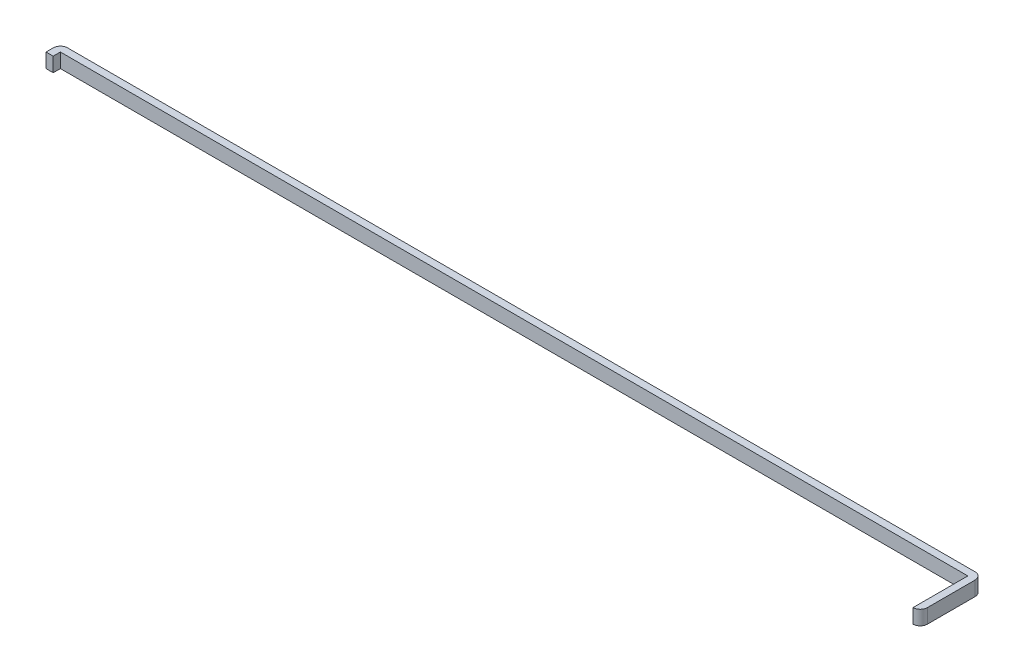
ISO-10303-21;
HEADER;
FILE_DESCRIPTION(('STEP AP214'),'2;1');
FILE_NAME('part.step','',(''),(''),'','','');
FILE_SCHEMA(('AUTOMOTIVE_DESIGN { 1 0 10303 214 1 1 1 1 }'));
ENDSEC;
DATA;
#1=APPLICATION_CONTEXT('core data for automotive mechanical design processes');
#2=APPLICATION_PROTOCOL_DEFINITION('international standard','automotive_design',2000,#1);
#3=PRODUCT_CONTEXT('',#1,'mechanical');
#4=PRODUCT('Part','Part','',(#3));
#5=PRODUCT_RELATED_PRODUCT_CATEGORY('part','',(#4));
#6=PRODUCT_DEFINITION_FORMATION('','',#4);
#7=PRODUCT_DEFINITION_CONTEXT('part definition',#1,'design');
#8=PRODUCT_DEFINITION('design','',#6,#7);
#9=PRODUCT_DEFINITION_SHAPE('','',#8);
#10=(LENGTH_UNIT() NAMED_UNIT(*) SI_UNIT(.MILLI.,.METRE.));
#11=(NAMED_UNIT(*) PLANE_ANGLE_UNIT() SI_UNIT($,.RADIAN.));
#12=(NAMED_UNIT(*) SI_UNIT($,.STERADIAN.) SOLID_ANGLE_UNIT());
#13=UNCERTAINTY_MEASURE_WITH_UNIT(LENGTH_MEASURE(1.E-05),#10,'distance_accuracy_value','');
#14=(GEOMETRIC_REPRESENTATION_CONTEXT(3) GLOBAL_UNCERTAINTY_ASSIGNED_CONTEXT((#13)) GLOBAL_UNIT_ASSIGNED_CONTEXT((#10,
#11,#12)) REPRESENTATION_CONTEXT('',''));
#15=CARTESIAN_POINT('',(0.,0.,0.));
#16=DIRECTION('',(0.,0.,1.));
#17=DIRECTION('',(1.,0.,0.));
#18=AXIS2_PLACEMENT_3D('',#15,#16,#17);
#19=CARTESIAN_POINT('',(-12.625,1.39381,0.20019));
#20=DIRECTION('',(0.,0.,-1.));
#21=DIRECTION('',(-1.,0.,0.));
#22=AXIS2_PLACEMENT_3D('',#19,#20,#21);
#23=PLANE('',#22);
#24=DIRECTION('',(0.,1.,0.));
#25=VECTOR('',#24,1.);
#26=CARTESIAN_POINT('',(12.635,1.39381,0.20019));
#27=LINE('',#26,#25);
#28=CARTESIAN_POINT('',(12.635,1.39381,0.20019));
#29=VERTEX_POINT('',#28);
#30=CARTESIAN_POINT('',(12.635,1.79419,0.20019));
#31=VERTEX_POINT('',#30);
#32=EDGE_CURVE('E125',#29,#31,#27,.T.);
#33=ORIENTED_EDGE('',*,*,#32,.T.);
#34=DIRECTION('',(1.,0.,0.));
#35=VECTOR('',#34,1.);
#36=CARTESIAN_POINT('',(12.635,1.79419,0.20019));
#37=LINE('',#36,#35);
#38=CARTESIAN_POINT('',(-12.625,1.79419,0.20019));
#39=VERTEX_POINT('',#38);
#40=EDGE_CURVE('E112',#31,#39,#37,.F.);
#41=ORIENTED_EDGE('',*,*,#40,.T.);
#42=DIRECTION('',(0.,1.,0.));
#43=VECTOR('',#42,1.);
#44=CARTESIAN_POINT('',(-12.625,1.39381,0.20019));
#45=LINE('',#44,#43);
#46=CARTESIAN_POINT('',(-12.625,1.39381,0.20019));
#47=VERTEX_POINT('',#46);
#48=EDGE_CURVE('E108',#39,#47,#45,.F.);
#49=ORIENTED_EDGE('',*,*,#48,.T.);
#50=DIRECTION('',(1.,0.,0.));
#51=VECTOR('',#50,1.);
#52=CARTESIAN_POINT('',(12.635,1.39381,0.20019));
#53=LINE('',#52,#51);
#54=EDGE_CURVE('E126',#29,#47,#53,.F.);
#55=ORIENTED_EDGE('',*,*,#54,.F.);
#56=EDGE_LOOP('',(#33,#41,#49,#55));
#57=FACE_BOUND('',#56,.T.);
#58=ADVANCED_FACE('F17',(#57),#23,.F.);
#59=CARTESIAN_POINT('',(-12.625,1.39381,0.40038));
#60=DIRECTION('',(-1.,0.,0.));
#61=DIRECTION('',(0.,0.,1.));
#62=AXIS2_PLACEMENT_3D('',#59,#60,#61);
#63=PLANE('',#62);
#64=ORIENTED_EDGE('',*,*,#48,.F.);
#65=DIRECTION('',(0.,0.,-1.));
#66=VECTOR('',#65,1.);
#67=CARTESIAN_POINT('',(-12.625,1.79419,0.20019));
#68=LINE('',#67,#66);
#69=CARTESIAN_POINT('',(-12.625,1.79419,0.40038));
#70=VERTEX_POINT('',#69);
#71=EDGE_CURVE('E120',#39,#70,#68,.F.);
#72=ORIENTED_EDGE('',*,*,#71,.T.);
#73=DIRECTION('',(0.,1.,0.));
#74=VECTOR('',#73,1.);
#75=CARTESIAN_POINT('',(-12.625,1.39381,0.40038));
#76=LINE('',#75,#74);
#77=CARTESIAN_POINT('',(-12.625,1.39381,0.40038));
#78=VERTEX_POINT('',#77);
#79=EDGE_CURVE('E177',#70,#78,#76,.F.);
#80=ORIENTED_EDGE('',*,*,#79,.T.);
#81=DIRECTION('',(0.,0.,-1.));
#82=VECTOR('',#81,1.);
#83=CARTESIAN_POINT('',(-12.625,1.39381,0.20019));
#84=LINE('',#83,#82);
#85=EDGE_CURVE('E168',#47,#78,#84,.F.);
#86=ORIENTED_EDGE('',*,*,#85,.F.);
#87=EDGE_LOOP('',(#64,#72,#80,#86));
#88=FACE_BOUND('',#87,.T.);
#89=ADVANCED_FACE('F227',(#88),#63,.F.);
#90=CARTESIAN_POINT('',(-12.82519,1.39381,0.40038));
#91=DIRECTION('',(0.,0.,-1.));
#92=DIRECTION('',(-1.,0.,0.));
#93=AXIS2_PLACEMENT_3D('',#90,#91,#92);
#94=PLANE('',#93);
#95=ORIENTED_EDGE('',*,*,#79,.F.);
#96=DIRECTION('',(1.,0.,0.));
#97=VECTOR('',#96,1.);
#98=CARTESIAN_POINT('',(12.635,1.79419,0.40038));
#99=LINE('',#98,#97);
#100=CARTESIAN_POINT('',(-12.82519,1.79419,0.40038));
#101=VERTEX_POINT('',#100);
#102=EDGE_CURVE('E145',#70,#101,#99,.F.);
#103=ORIENTED_EDGE('',*,*,#102,.T.);
#104=DIRECTION('',(0.,1.,0.));
#105=VECTOR('',#104,1.);
#106=CARTESIAN_POINT('',(-12.82519,1.39381,0.40038));
#107=LINE('',#106,#105);
#108=CARTESIAN_POINT('',(-12.82519,1.39381,0.40038));
#109=VERTEX_POINT('',#108);
#110=EDGE_CURVE('E184',#101,#109,#107,.F.);
#111=ORIENTED_EDGE('',*,*,#110,.T.);
#112=DIRECTION('',(1.,0.,0.));
#113=VECTOR('',#112,1.);
#114=CARTESIAN_POINT('',(12.635,1.39381,0.40038));
#115=LINE('',#114,#113);
#116=EDGE_CURVE('E86',#78,#109,#115,.F.);
#117=ORIENTED_EDGE('',*,*,#116,.F.);
#118=EDGE_LOOP('',(#95,#103,#111,#117));
#119=FACE_BOUND('',#118,.T.);
#120=ADVANCED_FACE('F226',(#119),#94,.F.);
#121=CARTESIAN_POINT('',(-12.82519,1.39381,0.20019));
#122=DIRECTION('',(1.,0.,0.));
#123=DIRECTION('',(0.,0.,-1.));
#124=AXIS2_PLACEMENT_3D('',#121,#122,#123);
#125=PLANE('',#124);
#126=ORIENTED_EDGE('',*,*,#110,.F.);
#127=DIRECTION('',(0.,0.,-1.));
#128=VECTOR('',#127,1.);
#129=CARTESIAN_POINT('',(-12.82519,1.79419,0.20019));
#130=LINE('',#129,#128);
#131=CARTESIAN_POINT('',(-12.82519,1.79419,0.20019));
#132=VERTEX_POINT('',#131);
#133=EDGE_CURVE('E148',#101,#132,#130,.T.);
#134=ORIENTED_EDGE('',*,*,#133,.T.);
#135=DIRECTION('',(0.,-1.,0.));
#136=VECTOR('',#135,1.);
#137=CARTESIAN_POINT('',(-12.82519,1.39381,0.20019));
#138=LINE('',#137,#136);
#139=CARTESIAN_POINT('',(-12.82519,1.39381,0.20019));
#140=VERTEX_POINT('',#139);
#141=EDGE_CURVE('E134',#140,#132,#138,.F.);
#142=ORIENTED_EDGE('',*,*,#141,.F.);
#143=DIRECTION('',(0.,0.,-1.));
#144=VECTOR('',#143,1.);
#145=CARTESIAN_POINT('',(-12.82519,1.39381,0.20019));
#146=LINE('',#145,#144);
#147=EDGE_CURVE('E80',#109,#140,#146,.T.);
#148=ORIENTED_EDGE('',*,*,#147,.F.);
#149=EDGE_LOOP('',(#126,#134,#142,#148));
#150=FACE_BOUND('',#149,.T.);
#151=ADVANCED_FACE('F224',(#150),#125,.F.);
#152=CARTESIAN_POINT('',(12.83519,1.39381,1.524905));
#153=DIRECTION('',(-1.,0.,0.));
#154=DIRECTION('',(0.,0.,1.));
#155=AXIS2_PLACEMENT_3D('',#152,#153,#154);
#156=PLANE('',#155);
#157=DIRECTION('',(0.,-1.,0.));
#158=VECTOR('',#157,1.);
#159=CARTESIAN_POINT('',(12.83519,1.39381,0.20019));
#160=LINE('',#159,#158);
#161=CARTESIAN_POINT('',(12.83519,1.79419,0.20019));
#162=VERTEX_POINT('',#161);
#163=CARTESIAN_POINT('',(12.83519,1.39381,0.20019));
#164=VERTEX_POINT('',#163);
#165=EDGE_CURVE('E74',#162,#164,#160,.T.);
#166=ORIENTED_EDGE('',*,*,#165,.F.);
#167=DIRECTION('',(0.,0.,-1.));
#168=VECTOR('',#167,1.);
#169=CARTESIAN_POINT('',(12.83519,1.79419,0.20019));
#170=LINE('',#169,#168);
#171=CARTESIAN_POINT('',(12.83519,1.79419,1.524905));
#172=VERTEX_POINT('',#171);
#173=EDGE_CURVE('E139',#162,#172,#170,.F.);
#174=ORIENTED_EDGE('',*,*,#173,.T.);
#175=DIRECTION('',(0.,-1.,0.));
#176=VECTOR('',#175,1.);
#177=CARTESIAN_POINT('',(12.83519,1.39381,1.524905));
#178=LINE('',#177,#176);
#179=CARTESIAN_POINT('',(12.83519,1.39381,1.524905));
#180=VERTEX_POINT('',#179);
#181=EDGE_CURVE('E190',#180,#172,#178,.F.);
#182=ORIENTED_EDGE('',*,*,#181,.F.);
#183=DIRECTION('',(0.,0.,-1.));
#184=VECTOR('',#183,1.);
#185=CARTESIAN_POINT('',(12.83519,1.39381,0.20019));
#186=LINE('',#185,#184);
#187=EDGE_CURVE('E160',#164,#180,#186,.F.);
#188=ORIENTED_EDGE('',*,*,#187,.F.);
#189=EDGE_LOOP('',(#166,#174,#182,#188));
#190=FACE_BOUND('',#189,.T.);
#191=ADVANCED_FACE('F216',(#190),#156,.F.);
#192=CARTESIAN_POINT('',(12.635,1.39381,1.524905));
#193=DIRECTION('',(0.,-1.,0.));
#194=DIRECTION('',(0.,0.,-1.));
#195=AXIS2_PLACEMENT_3D('',#192,#193,#194);
#196=CYLINDRICAL_SURFACE('',#195,0.20019);
#197=CARTESIAN_POINT('',(12.635,1.79419,1.524905));
#198=DIRECTION('',(0.,-1.,0.));
#199=DIRECTION('',(0.,0.,-1.));
#200=AXIS2_PLACEMENT_3D('',#197,#198,#199);
#201=CIRCLE('',#200,0.20019);
#202=CARTESIAN_POINT('',(12.635,1.79419,1.725095));
#203=VERTEX_POINT('',#202);
#204=EDGE_CURVE('E135',#172,#203,#201,.T.);
#205=ORIENTED_EDGE('',*,*,#204,.T.);
#206=DIRECTION('',(0.,1.,0.));
#207=VECTOR('',#206,1.);
#208=CARTESIAN_POINT('',(12.635,1.39381,1.725095));
#209=LINE('',#208,#207);
#210=CARTESIAN_POINT('',(12.635,1.39381,1.725095));
#211=VERTEX_POINT('',#210);
#212=EDGE_CURVE('E129',#203,#211,#209,.F.);
#213=ORIENTED_EDGE('',*,*,#212,.T.);
#214=CARTESIAN_POINT('',(12.635,1.39381,1.524905));
#215=DIRECTION('',(0.,-1.,0.));
#216=DIRECTION('',(0.,0.,-1.));
#217=AXIS2_PLACEMENT_3D('',#214,#215,#216);
#218=CIRCLE('',#217,0.20019);
#219=EDGE_CURVE('E156',#180,#211,#218,.T.);
#220=ORIENTED_EDGE('',*,*,#219,.F.);
#221=ORIENTED_EDGE('',*,*,#181,.T.);
#222=EDGE_LOOP('',(#205,#213,#220,#221));
#223=FACE_BOUND('',#222,.T.);
#224=ADVANCED_FACE('F218',(#223),#196,.T.);
#225=CARTESIAN_POINT('',(12.635,1.39381,0.20019));
#226=DIRECTION('',(1.,0.,0.));
#227=DIRECTION('',(0.,0.,-1.));
#228=AXIS2_PLACEMENT_3D('',#225,#226,#227);
#229=PLANE('',#228);
#230=DIRECTION('',(0.,0.,-1.));
#231=VECTOR('',#230,1.);
#232=CARTESIAN_POINT('',(12.635,1.39381,0.20019));
#233=LINE('',#232,#231);
#234=EDGE_CURVE('E159',#211,#29,#233,.T.);
#235=ORIENTED_EDGE('',*,*,#234,.F.);
#236=ORIENTED_EDGE('',*,*,#212,.F.);
#237=DIRECTION('',(0.,0.,-1.));
#238=VECTOR('',#237,1.);
#239=CARTESIAN_POINT('',(12.635,1.79419,0.20019));
#240=LINE('',#239,#238);
#241=EDGE_CURVE('E117',#203,#31,#240,.T.);
#242=ORIENTED_EDGE('',*,*,#241,.T.);
#243=ORIENTED_EDGE('',*,*,#32,.F.);
#244=EDGE_LOOP('',(#235,#236,#242,#243));
#245=FACE_BOUND('',#244,.T.);
#246=ADVANCED_FACE('F131',(#245),#229,.F.);
#247=CARTESIAN_POINT('',(12.635,1.39381,0.20019));
#248=DIRECTION('',(0.,-1.,0.));
#249=DIRECTION('',(0.,0.,-1.));
#250=AXIS2_PLACEMENT_3D('',#247,#248,#249);
#251=CYLINDRICAL_SURFACE('',#250,0.20019);
#252=CARTESIAN_POINT('',(12.635,1.79419,0.20019));
#253=DIRECTION('',(0.,-1.,0.));
#254=DIRECTION('',(0.,0.,-1.));
#255=AXIS2_PLACEMENT_3D('',#252,#253,#254);
#256=CIRCLE('',#255,0.20019);
#257=CARTESIAN_POINT('',(12.635,1.79419,0.));
#258=VERTEX_POINT('',#257);
#259=EDGE_CURVE('E20',#258,#162,#256,.T.);
#260=ORIENTED_EDGE('',*,*,#259,.T.);
#261=ORIENTED_EDGE('',*,*,#165,.T.);
#262=CARTESIAN_POINT('',(12.635,1.39381,0.20019));
#263=DIRECTION('',(0.,-1.,0.));
#264=DIRECTION('',(0.,0.,-1.));
#265=AXIS2_PLACEMENT_3D('',#262,#263,#264);
#266=CIRCLE('',#265,0.20019);
#267=CARTESIAN_POINT('',(12.635,1.39381,0.));
#268=VERTEX_POINT('',#267);
#269=EDGE_CURVE('E161',#268,#164,#266,.T.);
#270=ORIENTED_EDGE('',*,*,#269,.F.);
#271=DIRECTION('',(0.,1.,0.));
#272=VECTOR('',#271,1.);
#273=CARTESIAN_POINT('',(12.635,1.39381,0.));
#274=LINE('',#273,#272);
#275=EDGE_CURVE('E64',#268,#258,#274,.T.);
#276=ORIENTED_EDGE('',*,*,#275,.T.);
#277=EDGE_LOOP('',(#260,#261,#270,#276));
#278=FACE_BOUND('',#277,.T.);
#279=ADVANCED_FACE('F219',(#278),#251,.T.);
#280=CARTESIAN_POINT('',(12.635,1.79419,0.20019));
#281=DIRECTION('',(0.,-1.,0.));
#282=DIRECTION('',(0.,0.,-1.));
#283=AXIS2_PLACEMENT_3D('',#280,#281,#282);
#284=PLANE('',#283);
#285=ORIENTED_EDGE('',*,*,#241,.F.);
#286=ORIENTED_EDGE('',*,*,#204,.F.);
#287=ORIENTED_EDGE('',*,*,#173,.F.);
#288=ORIENTED_EDGE('',*,*,#259,.F.);
#289=DIRECTION('',(1.,0.,0.));
#290=VECTOR('',#289,1.);
#291=CARTESIAN_POINT('',(12.635,1.79419,0.));
#292=LINE('',#291,#290);
#293=CARTESIAN_POINT('',(-12.625,1.79419,0.));
#294=VERTEX_POINT('',#293);
#295=EDGE_CURVE('E204',#258,#294,#292,.F.);
#296=ORIENTED_EDGE('',*,*,#295,.T.);
#297=CARTESIAN_POINT('',(-12.625,1.79419,0.20019));
#298=DIRECTION('',(0.,-1.,0.));
#299=DIRECTION('',(0.,0.,-1.));
#300=AXIS2_PLACEMENT_3D('',#297,#298,#299);
#301=CIRCLE('',#300,0.20019);
#302=EDGE_CURVE('E137',#132,#294,#301,.T.);
#303=ORIENTED_EDGE('',*,*,#302,.F.);
#304=ORIENTED_EDGE('',*,*,#133,.F.);
#305=ORIENTED_EDGE('',*,*,#102,.F.);
#306=ORIENTED_EDGE('',*,*,#71,.F.);
#307=ORIENTED_EDGE('',*,*,#40,.F.);
#308=EDGE_LOOP('',(#285,#286,#287,#288,#296,#303,#304,#305,#306,#307));
#309=FACE_BOUND('',#308,.T.);
#310=ADVANCED_FACE('F114',(#309),#284,.F.);
#311=CARTESIAN_POINT('',(-12.625,1.39381,0.20019));
#312=DIRECTION('',(0.,-1.,0.));
#313=DIRECTION('',(0.,0.,-1.));
#314=AXIS2_PLACEMENT_3D('',#311,#312,#313);
#315=CYLINDRICAL_SURFACE('',#314,0.20019);
#316=ORIENTED_EDGE('',*,*,#302,.T.);
#317=DIRECTION('',(0.,1.,0.));
#318=VECTOR('',#317,1.);
#319=CARTESIAN_POINT('',(-12.625,1.39381,0.));
#320=LINE('',#319,#318);
#321=CARTESIAN_POINT('',(-12.625,1.39381,0.));
#322=VERTEX_POINT('',#321);
#323=EDGE_CURVE('E26',#294,#322,#320,.F.);
#324=ORIENTED_EDGE('',*,*,#323,.T.);
#325=CARTESIAN_POINT('',(-12.625,1.39381,0.20019));
#326=DIRECTION('',(0.,-1.,0.));
#327=DIRECTION('',(0.,0.,-1.));
#328=AXIS2_PLACEMENT_3D('',#325,#326,#327);
#329=CIRCLE('',#328,0.20019);
#330=EDGE_CURVE('E34',#140,#322,#329,.T.);
#331=ORIENTED_EDGE('',*,*,#330,.F.);
#332=ORIENTED_EDGE('',*,*,#141,.T.);
#333=EDGE_LOOP('',(#316,#324,#331,#332));
#334=FACE_BOUND('',#333,.T.);
#335=ADVANCED_FACE('F221',(#334),#315,.T.);
#336=CARTESIAN_POINT('',(12.635,1.39381,0.20019));
#337=DIRECTION('',(0.,-1.,0.));
#338=DIRECTION('',(0.,0.,-1.));
#339=AXIS2_PLACEMENT_3D('',#336,#337,#338);
#340=PLANE('',#339);
#341=ORIENTED_EDGE('',*,*,#219,.T.);
#342=ORIENTED_EDGE('',*,*,#234,.T.);
#343=ORIENTED_EDGE('',*,*,#54,.T.);
#344=ORIENTED_EDGE('',*,*,#85,.T.);
#345=ORIENTED_EDGE('',*,*,#116,.T.);
#346=ORIENTED_EDGE('',*,*,#147,.T.);
#347=ORIENTED_EDGE('',*,*,#330,.T.);
#348=DIRECTION('',(1.,0.,0.));
#349=VECTOR('',#348,1.);
#350=CARTESIAN_POINT('',(12.635,1.39381,0.));
#351=LINE('',#350,#349);
#352=EDGE_CURVE('E11',#322,#268,#351,.T.);
#353=ORIENTED_EDGE('',*,*,#352,.T.);
#354=ORIENTED_EDGE('',*,*,#269,.T.);
#355=ORIENTED_EDGE('',*,*,#187,.T.);
#356=EDGE_LOOP('',(#341,#342,#343,#344,#345,#346,#347,#353,#354,#355));
#357=FACE_BOUND('',#356,.T.);
#358=ADVANCED_FACE('F213',(#357),#340,.T.);
#359=CARTESIAN_POINT('',(12.635,1.39381,0.));
#360=DIRECTION('',(0.,0.,1.));
#361=DIRECTION('',(1.,0.,0.));
#362=AXIS2_PLACEMENT_3D('',#359,#360,#361);
#363=PLANE('',#362);
#364=ORIENTED_EDGE('',*,*,#323,.F.);
#365=ORIENTED_EDGE('',*,*,#295,.F.);
#366=ORIENTED_EDGE('',*,*,#275,.F.);
#367=ORIENTED_EDGE('',*,*,#352,.F.);
#368=EDGE_LOOP('',(#364,#365,#366,#367));
#369=FACE_BOUND('',#368,.T.);
#370=ADVANCED_FACE('F220',(#369),#363,.F.);
#371=CLOSED_SHELL('',(#58,#89,#120,#151,#191,#224,#246,#279,#310,#335,#358,#370));
#372=MANIFOLD_SOLID_BREP('B1',#371);
#373=ADVANCED_BREP_SHAPE_REPRESENTATION('',(#18,#372),#14);
#374=SHAPE_DEFINITION_REPRESENTATION(#9,#373);
ENDSEC;
END-ISO-10303-21;
